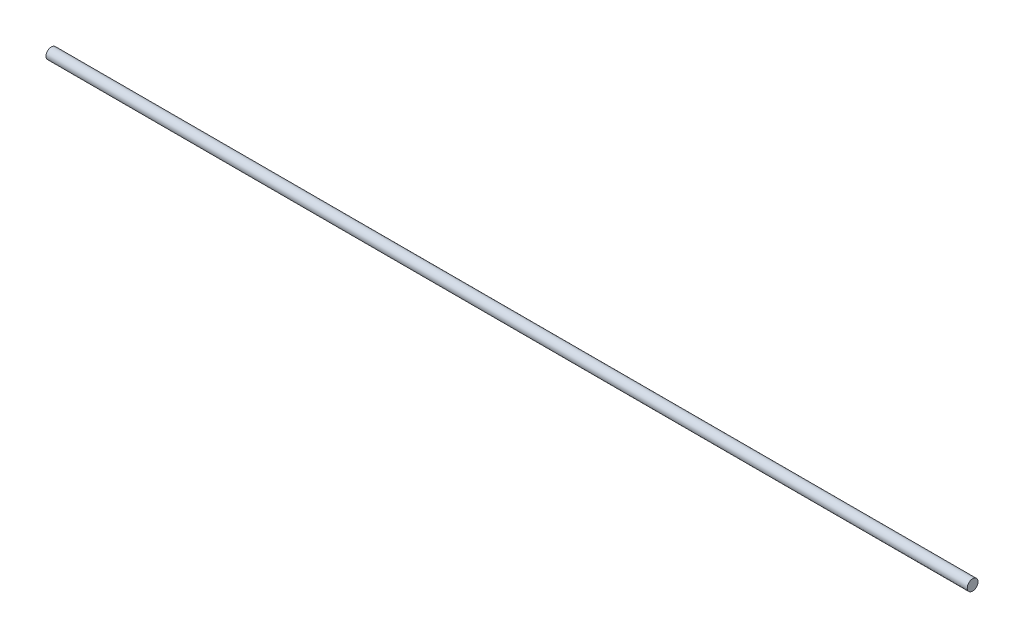
ISO-10303-21;
HEADER;
FILE_DESCRIPTION(('STEP AP214'),'2;1');
FILE_NAME('part.step','',(''),(''),'','','');
FILE_SCHEMA(('AUTOMOTIVE_DESIGN { 1 0 10303 214 1 1 1 1 }'));
ENDSEC;
DATA;
#1=APPLICATION_CONTEXT('core data for automotive mechanical design processes');
#2=APPLICATION_PROTOCOL_DEFINITION('international standard','automotive_design',2000,#1);
#3=PRODUCT_CONTEXT('',#1,'mechanical');
#4=PRODUCT('Part','Part','',(#3));
#5=PRODUCT_RELATED_PRODUCT_CATEGORY('part','',(#4));
#6=PRODUCT_DEFINITION_FORMATION('','',#4);
#7=PRODUCT_DEFINITION_CONTEXT('part definition',#1,'design');
#8=PRODUCT_DEFINITION('design','',#6,#7);
#9=PRODUCT_DEFINITION_SHAPE('','',#8);
#10=(LENGTH_UNIT() NAMED_UNIT(*) SI_UNIT(.MILLI.,.METRE.));
#11=(NAMED_UNIT(*) PLANE_ANGLE_UNIT() SI_UNIT($,.RADIAN.));
#12=(NAMED_UNIT(*) SI_UNIT($,.STERADIAN.) SOLID_ANGLE_UNIT());
#13=UNCERTAINTY_MEASURE_WITH_UNIT(LENGTH_MEASURE(1.E-05),#10,'distance_accuracy_value','');
#14=(GEOMETRIC_REPRESENTATION_CONTEXT(3) GLOBAL_UNCERTAINTY_ASSIGNED_CONTEXT((#13)) GLOBAL_UNIT_ASSIGNED_CONTEXT((#10,
#11,#12)) REPRESENTATION_CONTEXT('',''));
#15=CARTESIAN_POINT('',(0.,0.,0.));
#16=DIRECTION('',(0.,0.,1.));
#17=DIRECTION('',(1.,0.,0.));
#18=AXIS2_PLACEMENT_3D('',#15,#16,#17);
#19=CARTESIAN_POINT('',(609.6,0.,0.));
#20=DIRECTION('',(-1.,0.,0.));
#21=DIRECTION('',(0.,0.,1.));
#22=AXIS2_PLACEMENT_3D('',#19,#20,#21);
#23=CYLINDRICAL_SURFACE('',#22,3.565);
#24=CARTESIAN_POINT('',(609.6,0.,0.));
#25=DIRECTION('',(1.,0.,0.));
#26=DIRECTION('',(0.,0.,-1.));
#27=AXIS2_PLACEMENT_3D('',#24,#25,#26);
#28=CIRCLE('',#27,3.565);
#29=CARTESIAN_POINT('',(609.6,0.,3.565));
#30=VERTEX_POINT('',#29);
#31=EDGE_CURVE('E10',#30,#30,#28,.T.);
#32=CARTESIAN_POINT('',(0.,0.,0.));
#33=DIRECTION('',(1.,0.,0.));
#34=DIRECTION('',(0.,0.,-1.));
#35=AXIS2_PLACEMENT_3D('',#32,#33,#34);
#36=CIRCLE('',#35,3.565);
#37=CARTESIAN_POINT('',(0.,0.,3.565));
#38=VERTEX_POINT('',#37);
#39=EDGE_CURVE('E35',#38,#38,#36,.T.);
#40=CARTESIAN_POINT('',(609.6,0.,3.565));
#41=CARTESIAN_POINT('',(603.25,0.,3.565));
#42=CARTESIAN_POINT('',(596.9,0.,3.565));
#43=CARTESIAN_POINT('',(584.2,0.,3.565));
#44=CARTESIAN_POINT('',(577.85,0.,3.565));
#45=CARTESIAN_POINT('',(565.15,0.,3.565));
#46=CARTESIAN_POINT('',(558.8,0.,3.565));
#47=CARTESIAN_POINT('',(546.1,0.,3.565));
#48=CARTESIAN_POINT('',(539.75,0.,3.565));
#49=CARTESIAN_POINT('',(527.05,0.,3.565));
#50=CARTESIAN_POINT('',(520.7,0.,3.565));
#51=CARTESIAN_POINT('',(508.,0.,3.565));
#52=CARTESIAN_POINT('',(501.65,0.,3.565));
#53=CARTESIAN_POINT('',(488.95,0.,3.565));
#54=CARTESIAN_POINT('',(482.6,0.,3.565));
#55=CARTESIAN_POINT('',(469.9,0.,3.565));
#56=CARTESIAN_POINT('',(463.55,0.,3.565));
#57=CARTESIAN_POINT('',(450.85,0.,3.565));
#58=CARTESIAN_POINT('',(444.5,0.,3.565));
#59=CARTESIAN_POINT('',(431.8,0.,3.565));
#60=CARTESIAN_POINT('',(425.45,0.,3.565));
#61=CARTESIAN_POINT('',(412.75,0.,3.565));
#62=CARTESIAN_POINT('',(406.4,0.,3.565));
#63=CARTESIAN_POINT('',(393.7,0.,3.565));
#64=CARTESIAN_POINT('',(387.35,0.,3.565));
#65=CARTESIAN_POINT('',(374.65,0.,3.565));
#66=CARTESIAN_POINT('',(368.3,0.,3.565));
#67=CARTESIAN_POINT('',(355.6,0.,3.565));
#68=CARTESIAN_POINT('',(349.25,0.,3.565));
#69=CARTESIAN_POINT('',(336.55,0.,3.565));
#70=CARTESIAN_POINT('',(330.2,0.,3.565));
#71=CARTESIAN_POINT('',(317.5,0.,3.565));
#72=CARTESIAN_POINT('',(311.15,0.,3.565));
#73=CARTESIAN_POINT('',(298.45,0.,3.565));
#74=CARTESIAN_POINT('',(292.1,0.,3.565));
#75=CARTESIAN_POINT('',(279.4,0.,3.565));
#76=CARTESIAN_POINT('',(273.05,0.,3.565));
#77=CARTESIAN_POINT('',(260.35,0.,3.565));
#78=CARTESIAN_POINT('',(254.,0.,3.565));
#79=CARTESIAN_POINT('',(241.3,0.,3.565));
#80=CARTESIAN_POINT('',(234.95,0.,3.565));
#81=CARTESIAN_POINT('',(222.25,0.,3.565));
#82=CARTESIAN_POINT('',(215.9,0.,3.565));
#83=CARTESIAN_POINT('',(203.2,0.,3.565));
#84=CARTESIAN_POINT('',(196.85,0.,3.565));
#85=CARTESIAN_POINT('',(184.15,0.,3.565));
#86=CARTESIAN_POINT('',(177.8,0.,3.565));
#87=CARTESIAN_POINT('',(165.1,0.,3.565));
#88=CARTESIAN_POINT('',(158.75,0.,3.565));
#89=CARTESIAN_POINT('',(146.05,0.,3.565));
#90=CARTESIAN_POINT('',(139.7,0.,3.565));
#91=CARTESIAN_POINT('',(127.,0.,3.565));
#92=CARTESIAN_POINT('',(120.65,0.,3.565));
#93=CARTESIAN_POINT('',(107.95,0.,3.565));
#94=CARTESIAN_POINT('',(101.6,0.,3.565));
#95=CARTESIAN_POINT('',(88.9,0.,3.565));
#96=CARTESIAN_POINT('',(82.5500000000001,0.,3.565));
#97=CARTESIAN_POINT('',(69.85,0.,3.565));
#98=CARTESIAN_POINT('',(63.5,0.,3.565));
#99=CARTESIAN_POINT('',(50.8,0.,3.565));
#100=CARTESIAN_POINT('',(44.45,0.,3.565));
#101=CARTESIAN_POINT('',(31.75,0.,3.565));
#102=CARTESIAN_POINT('',(25.4,0.,3.565));
#103=CARTESIAN_POINT('',(12.7,0.,3.565));
#104=CARTESIAN_POINT('',(6.35000000000001,0.,3.565));
#105=CARTESIAN_POINT('',(0.,0.,3.565));
#106=B_SPLINE_CURVE_WITH_KNOTS('',3,(#40,#41,#42,#43,#44,#45,#46,#47,#48,#49,#50,#51,#52,#53,
#54,#55,#56,#57,#58,#59,#60,#61,#62,#63,#64,#65,#66,#67,#68,#69,#70,#71,#72,#73,#74,#75,#76,#77,
#78,#79,#80,#81,#82,#83,#84,#85,#86,#87,#88,#89,#90,#91,#92,#93,#94,#95,#96,#97,#98,#99,#100,
#101,#102,#103,#104,#105),.UNSPECIFIED.,.F.,.F.,(4,2,2,2,2,2,2,2,2,2,2,2,2,2,2,2,2,2,2,2,2,2,2,
2,2,2,2,2,2,2,2,2,4),(0.,19.0499999999999,38.0999999999999,57.1499999999999,76.1999999999999,
95.2499999999999,114.3,133.35,152.4,171.45,190.5,209.55,228.6,247.65,266.7,285.75,304.8,323.85,
342.9,361.95,381.,400.05,419.1,438.15,457.2,476.25,495.3,514.35,533.4,552.45,571.5,590.55,
609.6),.UNSPECIFIED.);
#107=EDGE_CURVE('BSEAM32',#30,#38,#106,.T.);
#108=ORIENTED_EDGE('',*,*,#31,.F.);
#109=ORIENTED_EDGE('',*,*,#39,.T.);
#110=ORIENTED_EDGE('',*,*,#107,.T.);
#111=ORIENTED_EDGE('',*,*,#107,.F.);
#112=EDGE_LOOP('',(#108,#110,#109,#111));
#113=FACE_BOUND('',#112,.T.);
#114=ADVANCED_FACE('F32',(#113),#23,.T.);
#115=CARTESIAN_POINT('',(609.6,0.,0.));
#116=DIRECTION('',(1.,0.,0.));
#117=DIRECTION('',(0.,0.,-1.));
#118=AXIS2_PLACEMENT_3D('',#115,#116,#117);
#119=PLANE('',#118);
#120=ORIENTED_EDGE('',*,*,#31,.T.);
#121=EDGE_LOOP('',(#120));
#122=FACE_BOUND('',#121,.T.);
#123=ADVANCED_FACE('F47',(#122),#119,.T.);
#124=CARTESIAN_POINT('',(0.,0.,0.));
#125=DIRECTION('',(1.,0.,0.));
#126=DIRECTION('',(0.,0.,-1.));
#127=AXIS2_PLACEMENT_3D('',#124,#125,#126);
#128=PLANE('',#127);
#129=ORIENTED_EDGE('',*,*,#39,.F.);
#130=EDGE_LOOP('',(#129));
#131=FACE_BOUND('',#130,.T.);
#132=ADVANCED_FACE('F45',(#131),#128,.F.);
#133=CLOSED_SHELL('',(#114,#123,#132));
#134=MANIFOLD_SOLID_BREP('B2',#133);
#135=ADVANCED_BREP_SHAPE_REPRESENTATION('',(#18,#134),#14);
#136=SHAPE_DEFINITION_REPRESENTATION(#9,#135);
ENDSEC;
END-ISO-10303-21;
